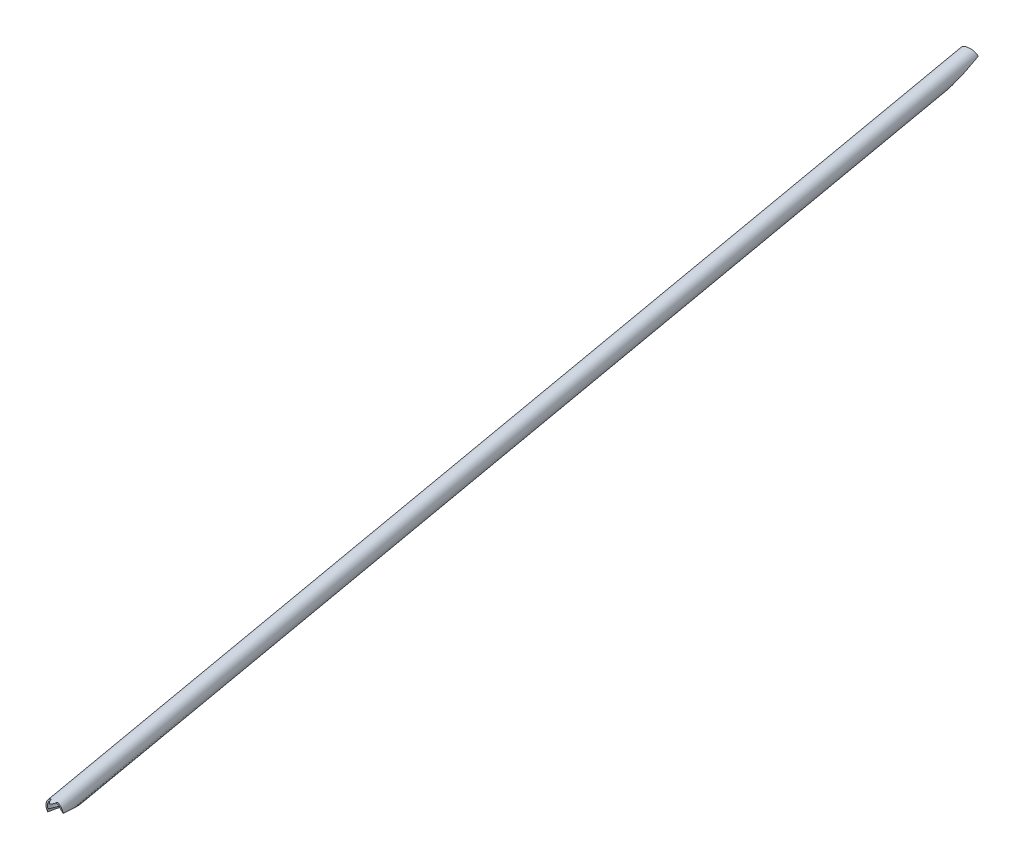
ISO-10303-21;
HEADER;
FILE_DESCRIPTION(('STEP AP214'),'2;1');
FILE_NAME('part.step','',(''),(''),'','','');
FILE_SCHEMA(('AUTOMOTIVE_DESIGN { 1 0 10303 214 1 1 1 1 }'));
ENDSEC;
DATA;
#1=APPLICATION_CONTEXT('core data for automotive mechanical design processes');
#2=APPLICATION_PROTOCOL_DEFINITION('international standard','automotive_design',2000,#1);
#3=PRODUCT_CONTEXT('',#1,'mechanical');
#4=PRODUCT('Part','Part','',(#3));
#5=PRODUCT_RELATED_PRODUCT_CATEGORY('part','',(#4));
#6=PRODUCT_DEFINITION_FORMATION('','',#4);
#7=PRODUCT_DEFINITION_CONTEXT('part definition',#1,'design');
#8=PRODUCT_DEFINITION('design','',#6,#7);
#9=PRODUCT_DEFINITION_SHAPE('','',#8);
#10=(LENGTH_UNIT() NAMED_UNIT(*) SI_UNIT(.MILLI.,.METRE.));
#11=(NAMED_UNIT(*) PLANE_ANGLE_UNIT() SI_UNIT($,.RADIAN.));
#12=(NAMED_UNIT(*) SI_UNIT($,.STERADIAN.) SOLID_ANGLE_UNIT());
#13=UNCERTAINTY_MEASURE_WITH_UNIT(LENGTH_MEASURE(1.E-05),#10,'distance_accuracy_value','');
#14=(GEOMETRIC_REPRESENTATION_CONTEXT(3) GLOBAL_UNCERTAINTY_ASSIGNED_CONTEXT((#13)) GLOBAL_UNIT_ASSIGNED_CONTEXT((#10,
#11,#12)) REPRESENTATION_CONTEXT('',''));
#15=CARTESIAN_POINT('',(0.,0.,0.));
#16=DIRECTION('',(0.,0.,1.));
#17=DIRECTION('',(1.,0.,0.));
#18=AXIS2_PLACEMENT_3D('',#15,#16,#17);
#19=CARTESIAN_POINT('',(-225.,200.,-450.));
#20=DIRECTION('',(-0.0876619818920292,0.105194378270435,-0.99058039537993));
#21=DIRECTION('',(0.,0.994408591727349,0.105600912395825));
#22=AXIS2_PLACEMENT_3D('',#19,#20,#21);
#23=CYLINDRICAL_SURFACE('',#22,7.90000000000002);
#24=CARTESIAN_POINT('',(-324.494857679556,327.249657090113,-1573.45764457105));
#25=CARTESIAN_POINT('',(-324.296689879201,327.249538639366,-1573.45650378848));
#26=CARTESIAN_POINT('',(-324.098568587815,327.241799828148,-1573.45368803407));
#27=CARTESIAN_POINT('',(-323.703552705225,327.211164300513,-1573.44371775323));
#28=CARTESIAN_POINT('',(-323.506658323396,327.188265064786,-1573.4365625057));
#29=CARTESIAN_POINT('',(-323.115284979527,327.127502560573,-1573.41673382982));
#30=CARTESIAN_POINT('',(-322.920808373339,327.089625721913,-1573.40405539623));
#31=CARTESIAN_POINT('',(-322.535834925719,326.999337341449,-1573.37181583881));
#32=CARTESIAN_POINT('',(-322.345337913884,326.946926423361,-1573.35225501033));
#33=CARTESIAN_POINT('',(-321.968884951476,326.827974486444,-1573.30462379601));
#34=CARTESIAN_POINT('',(-321.78295448848,326.76136835069,-1573.27651393087));
#35=CARTESIAN_POINT('',(-321.418095876194,326.615202277705,-1573.210206048));
#36=CARTESIAN_POINT('',(-321.239167718372,326.535642356255,-1573.17200804257));
#37=CARTESIAN_POINT('',(-320.890098910487,326.36511854164,-1573.08404347995));
#38=CARTESIAN_POINT('',(-320.71994624847,326.274170854375,-1573.03429327836));
#39=CARTESIAN_POINT('',(-320.389611823924,326.082634658492,-1572.92192667784));
#40=CARTESIAN_POINT('',(-320.229429006663,325.982047172559,-1572.85931164294));
#41=CARTESIAN_POINT('',(-319.932123979686,325.781469743354,-1572.72578816087));
#42=CARTESIAN_POINT('',(-319.794175769135,325.682029633556,-1572.65588890184));
#43=CARTESIAN_POINT('',(-319.52839231927,325.47868486577,-1572.50434293717));
#44=CARTESIAN_POINT('',(-319.400557458651,325.374780040825,-1572.42269579195));
#45=CARTESIAN_POINT('',(-319.155265512826,325.164367808314,-1572.24803421173));
#46=CARTESIAN_POINT('',(-319.037807542894,325.057860623614,-1572.15502074744));
#47=CARTESIAN_POINT('',(-318.813091607563,324.843872647055,-1571.95841469823));
#48=CARTESIAN_POINT('',(-318.705835157597,324.736391713135,-1571.85482054629));
#49=CARTESIAN_POINT('',(-318.459675903139,324.478464565054,-1571.59434431257));
#50=CARTESIAN_POINT('',(-318.325479765852,324.328191682368,-1571.43283429691));
#51=CARTESIAN_POINT('',(-318.074111079321,324.030884082435,-1571.09434898846));
#52=CARTESIAN_POINT('',(-317.95694736986,323.883851080024,-1570.91736574087));
#53=CARTESIAN_POINT('',(-317.736819343712,323.593793305635,-1570.55046108381));
#54=CARTESIAN_POINT('',(-317.633909897027,323.450785623584,-1570.36049366458));
#55=CARTESIAN_POINT('',(-317.440451749016,323.169805186999,-1569.97094503028));
#56=CARTESIAN_POINT('',(-317.349900434665,323.031831372629,-1569.77136585966));
#57=CARTESIAN_POINT('',(-317.199957829584,322.793940097284,-1569.41442038714));
#58=CARTESIAN_POINT('',(-317.13836178898,322.692967526511,-1569.25866686775));
#59=CARTESIAN_POINT('',(-317.020274836136,322.493666588615,-1568.94356475505));
#60=CARTESIAN_POINT('',(-316.963784348933,322.395338442117,-1568.78421586382));
#61=CARTESIAN_POINT('',(-316.800922063443,322.103954452083,-1568.30154073546));
#62=CARTESIAN_POINT('',(-316.70121771933,321.914593203998,-1567.97372895926));
#63=CARTESIAN_POINT('',(-316.515376743058,321.543720986637,-1567.30900993216));
#64=CARTESIAN_POINT('',(-316.429271478182,321.362228847307,-1566.97208369397));
#65=CARTESIAN_POINT('',(-316.268117257677,321.006019309157,-1566.29220230802));
#66=CARTESIAN_POINT('',(-316.19306568849,320.831300316102,-1565.94924860693));
#67=CARTESIAN_POINT('',(-316.051643042864,320.486328315659,-1565.2569273148));
#68=CARTESIAN_POINT('',(-315.98532187534,320.316105086501,-1564.90753485068));
#69=CARTESIAN_POINT('',(-315.860440569791,319.980007757438,-1564.20528290703));
#70=CARTESIAN_POINT('',(-315.801880792083,319.814133859735,-1563.85242326736));
#71=CARTESIAN_POINT('',(-315.691609507874,319.486055138055,-1563.14453305405));
#72=CARTESIAN_POINT('',(-315.639888949028,319.323845704612,-1562.78950601412));
#73=CARTESIAN_POINT('',(-315.542511869236,319.002125561371,-1562.07740066217));
#74=CARTESIAN_POINT('',(-315.496855483472,318.842614911804,-1561.7203223046));
#75=CARTESIAN_POINT('',(-315.396879955877,318.47303460663,-1560.88568248539));
#76=CARTESIAN_POINT('',(-315.344721855638,318.263773145231,-1560.40750427127));
#77=CARTESIAN_POINT('',(-315.249596336802,317.847777368105,-1559.44913529436));
#78=CARTESIAN_POINT('',(-315.206629117999,317.641043107407,-1558.96894448805));
#79=CARTESIAN_POINT('',(-315.129541178523,317.229060849197,-1558.00693466545));
#80=CARTESIAN_POINT('',(-315.095424867012,317.023813641774,-1557.52511495832));
#81=CARTESIAN_POINT('',(-315.036031448654,316.614121246245,-1556.56059733395));
#82=CARTESIAN_POINT('',(-315.01075424154,316.409676049067,-1556.07789942674));
#83=CARTESIAN_POINT('',(-314.969344831441,316.001678455156,-1555.11391145681));
#84=CARTESIAN_POINT('',(-314.953178033362,315.798125633518,-1554.6326230675));
#85=CARTESIAN_POINT('',(-314.930322094859,315.390504567365,-1553.67002523162));
#86=CARTESIAN_POINT('',(-314.923633119733,315.186436313923,-1553.18871578483));
#87=CARTESIAN_POINT('',(-314.920502797645,314.777260747945,-1552.22670390903));
#88=CARTESIAN_POINT('',(-314.924057750783,314.572153837263,-1551.74600132357));
#89=CARTESIAN_POINT('',(-314.942528637667,314.160221340324,-1550.7855659987));
#90=CARTESIAN_POINT('',(-314.957444024236,313.953395837317,-1550.30583321368));
#91=CARTESIAN_POINT('',(-315.000276313997,313.536997695759,-1549.34717804512));
#92=CARTESIAN_POINT('',(-315.028214843862,313.327421053337,-1548.86825834464));
#93=CARTESIAN_POINT('',(-315.099405333054,312.905018527821,-1547.91281552302));
#94=CARTESIAN_POINT('',(-315.142660657017,312.69219194065,-1547.4362929518));
#95=CARTESIAN_POINT('',(-315.221645137719,312.369774538986,-1546.72438601082));
#96=CARTESIAN_POINT('',(-315.250332139892,312.261746133146,-1546.48750658461));
#97=CARTESIAN_POINT('',(-315.313022687496,312.044490352863,-1546.01500888857));
#98=CARTESIAN_POINT('',(-315.347026002803,311.935263030506,-1545.7793905646));
#99=CARTESIAN_POINT('',(-315.421083506967,311.715474810918,-1545.30984127215));
#100=CARTESIAN_POINT('',(-315.461135275332,311.604914463354,-1545.07590966773));
#101=CARTESIAN_POINT('',(-315.548270316078,311.382217832965,-1544.61012717344));
#102=CARTESIAN_POINT('',(-315.595352974154,311.270081688596,-1544.37827610367));
#103=CARTESIAN_POINT('',(-315.697996902301,311.043626799201,-1543.91659059503));
#104=CARTESIAN_POINT('',(-315.753583924849,310.929302380059,-1543.68676460259));
#105=CARTESIAN_POINT('',(-315.874921606526,310.69846183182,-1543.23076529918));
#106=CARTESIAN_POINT('',(-315.940676166764,310.581944876619,-1543.00459342718));
#107=CARTESIAN_POINT('',(-316.084851112295,310.346386101057,-1542.55752599592));
#108=CARTESIAN_POINT('',(-316.163275219398,310.227343547729,-1542.33663200907));
#109=CARTESIAN_POINT('',(-316.336359605011,309.986461535556,-1541.90292636534));
#110=CARTESIAN_POINT('',(-316.43100470029,309.864624783698,-1541.69010737557));
#111=CARTESIAN_POINT('',(-316.589865836077,309.679028343337,-1541.3796691742));
#112=CARTESIAN_POINT('',(-316.645929308063,309.616397816582,-1541.27720908763));
#113=CARTESIAN_POINT('',(-316.764659640415,309.490400689369,-1541.07668911655));
#114=CARTESIAN_POINT('',(-316.827323560864,309.427034427712,-1540.97862730053));
#115=CARTESIAN_POINT('',(-316.960230477743,309.299929267425,-1540.78876318804));
#116=CARTESIAN_POINT('',(-317.030440625479,309.236193041742,-1540.69693639098));
#117=CARTESIAN_POINT('',(-317.180056156801,309.108462917701,-1540.52140088796));
#118=CARTESIAN_POINT('',(-317.259450092758,309.04446943409,-1540.43768230933));
#119=CARTESIAN_POINT('',(-317.421730201267,308.922379814471,-1540.28829766725));
#120=CARTESIAN_POINT('',(-317.503717018741,308.864253344943,-1540.22169579862));
#121=CARTESIAN_POINT('',(-317.67771096299,308.749330958372,-1540.10142642838));
#122=CARTESIAN_POINT('',(-317.769716198409,308.692534792635,-1540.0477564915));
#123=CARTESIAN_POINT('',(-317.965045413378,308.581279953833,-1539.95714042787));
#124=CARTESIAN_POINT('',(-318.068501737599,308.526861587815,-1539.9204223047));
#125=CARTESIAN_POINT('',(-318.283433154133,308.423812299123,-1539.86918960217));
#126=CARTESIAN_POINT('',(-318.3948925868,308.375170543253,-1539.85463283617));
#127=CARTESIAN_POINT('',(-318.60711923908,308.291626843632,-1539.84963816308));
#128=CARTESIAN_POINT('',(-318.707454957303,308.255765153183,-1539.85638161908));
#129=CARTESIAN_POINT('',(-318.907808007856,308.190896460869,-1539.88672246772));
#130=CARTESIAN_POINT('',(-319.007824860652,308.161897143933,-1539.91033863773));
#131=CARTESIAN_POINT('',(-319.238862427166,308.101860007865,-1539.98227890872));
#132=CARTESIAN_POINT('',(-319.368779585226,308.07352094242,-1540.03629282289));
#133=CARTESIAN_POINT('',(-319.62119529399,308.027094458755,-1540.16279453474));
#134=CARTESIAN_POINT('',(-319.743675158505,308.009031979741,-1540.23532666022));
#135=CARTESIAN_POINT('',(-319.969599191799,307.982387938161,-1540.3857427258));
#136=CARTESIAN_POINT('',(-320.073747362824,307.973070129794,-1540.46246814865));
#137=CARTESIAN_POINT('',(-320.276276584897,307.959786625695,-1540.62368643787));
#138=CARTESIAN_POINT('',(-320.374652392829,307.955825725869,-1540.70818619223));
#139=CARTESIAN_POINT('',(-320.566422713659,307.952229306429,-1540.88312518192));
#140=CARTESIAN_POINT('',(-320.659804908962,307.9526040278,-1540.97357797787));
#141=CARTESIAN_POINT('',(-320.84194049228,307.956915024125,-1541.15883970481));
#142=CARTESIAN_POINT('',(-320.930695666293,307.960849913952,-1541.25364692806));
#143=CARTESIAN_POINT('',(-321.156812341659,307.974948815367,-1541.50520492789));
#144=CARTESIAN_POINT('',(-321.291015359324,307.987443131687,-1541.66465906551));
#145=CARTESIAN_POINT('',(-321.551043556912,308.018259474915,-1541.98976454144));
#146=CARTESIAN_POINT('',(-321.676863915537,308.036584821145,-1542.15541936198));
#147=CARTESIAN_POINT('',(-321.921727301815,308.077912040002,-1542.49155331777));
#148=CARTESIAN_POINT('',(-322.040757052046,308.100922697763,-1542.66204099014));
#149=CARTESIAN_POINT('',(-322.272892655858,308.150752664434,-1543.00646359163));
#150=CARTESIAN_POINT('',(-322.385997802243,308.177572426611,-1543.18039892889));
#151=CARTESIAN_POINT('',(-322.607773821035,308.234570916902,-1543.53198519189));
#152=CARTESIAN_POINT('',(-322.716414523275,308.264768566624,-1543.70965200527));
#153=CARTESIAN_POINT('',(-322.929230721901,308.327925203974,-1544.06715695747));
#154=CARTESIAN_POINT('',(-323.033406029452,308.360884308205,-1544.2469951877));
#155=CARTESIAN_POINT('',(-323.237691766775,308.429157858901,-1544.608188908));
#156=CARTESIAN_POINT('',(-323.33780750058,308.464469061509,-1544.78954201867));
#157=CARTESIAN_POINT('',(-323.534553941249,308.537209015438,-1545.15369710217));
#158=CARTESIAN_POINT('',(-323.631184718614,308.574637723882,-1545.33649904559));
#159=CARTESIAN_POINT('',(-323.925182575597,308.693297336177,-1545.90363673839));
#160=CARTESIAN_POINT('',(-324.117306320486,308.777721433603,-1546.29002923335));
#161=CARTESIAN_POINT('',(-324.490488392503,308.953381461244,-1547.06661552691));
#162=CARTESIAN_POINT('',(-324.671545051867,309.044618413551,-1547.45680988822));
#163=CARTESIAN_POINT('',(-325.024433369406,309.233001075117,-1548.24017013204));
#164=CARTESIAN_POINT('',(-325.196260325262,309.330149743498,-1548.63333741498));
#165=CARTESIAN_POINT('',(-325.531927538286,309.529676363253,-1549.42175193099));
#166=CARTESIAN_POINT('',(-325.695767541467,309.632054480713,-1549.81699922976));
#167=CARTESIAN_POINT('',(-326.016936547975,309.841916173979,-1550.61017442227));
#168=CARTESIAN_POINT('',(-326.174245526068,309.949413552583,-1551.0081067531));
#169=CARTESIAN_POINT('',(-326.482665345276,310.168977603534,-1551.80511199595));
#170=CARTESIAN_POINT('',(-326.63377611252,310.281044330308,-1552.2041849215));
#171=CARTESIAN_POINT('',(-326.930399703143,310.509573665269,-1553.00298692872));
#172=CARTESIAN_POINT('',(-327.075914368412,310.626034801647,-1553.40271574854));
#173=CARTESIAN_POINT('',(-327.361932648536,310.863368882901,-1554.20266225174));
#174=CARTESIAN_POINT('',(-327.502436179777,310.984241901325,-1554.60287994316));
#175=CARTESIAN_POINT('',(-327.77850371143,311.230159114626,-1555.40245228373));
#176=CARTESIAN_POINT('',(-327.914079788087,311.355191437815,-1555.80180641745));
#177=CARTESIAN_POINT('',(-328.181044800087,311.609925425136,-1556.60042503442));
#178=CARTESIAN_POINT('',(-328.312433734094,311.739627090759,-1556.99968951766));
#179=CARTESIAN_POINT('',(-328.571356402029,312.004050472082,-1557.79792300007));
#180=CARTESIAN_POINT('',(-328.698889204922,312.138773382871,-1558.19689190555));
#181=CARTESIAN_POINT('',(-328.950310562262,312.413673716783,-1558.99409674171));
#182=CARTESIAN_POINT('',(-329.074199143293,312.5538511001,-1559.39233267771));
#183=CARTESIAN_POINT('',(-329.318245389817,312.839984949712,-1560.18677817144));
#184=CARTESIAN_POINT('',(-329.438410818075,312.985927712733,-1560.58299027211));
#185=CARTESIAN_POINT('',(-329.675418687416,313.284757197686,-1561.37378455245));
#186=CARTESIAN_POINT('',(-329.792261190781,313.437643789329,-1561.76836676255));
#187=CARTESIAN_POINT('',(-330.022616868952,313.751493203861,-1562.55512964749));
#188=CARTESIAN_POINT('',(-330.136131134015,313.912453334125,-1562.9473110747));
#189=CARTESIAN_POINT('',(-330.359764709317,314.244078548903,-1563.72851006297));
#190=CARTESIAN_POINT('',(-330.469884337589,314.414742719989,-1564.11752791789));
#191=CARTESIAN_POINT('',(-330.626810690119,314.670757922289,-1564.6782364532));
#192=CARTESIAN_POINT('',(-330.675102357827,314.751359278212,-1564.85168460444));
#193=CARTESIAN_POINT('',(-330.770877982967,314.915230624765,-1565.19754116823));
#194=CARTESIAN_POINT('',(-330.818361936591,314.998500627972,-1565.36994957589));
#195=CARTESIAN_POINT('',(-330.959529250973,315.252774606978,-1565.88545822749));
#196=CARTESIAN_POINT('',(-331.051903602585,315.428203020807,-1566.22675455689));
#197=CARTESIAN_POINT('',(-331.232224595111,315.793571519908,-1566.90249218801));
#198=CARTESIAN_POINT('',(-331.320173945472,315.983502541281,-1567.23693760831));
#199=CARTESIAN_POINT('',(-331.447556003406,316.282132305849,-1567.73142737195));
#200=CARTESIAN_POINT('',(-331.489255802438,316.383953703808,-1567.89504510117));
#201=CARTESIAN_POINT('',(-331.570817842546,316.592758002812,-1568.21941280823));
#202=CARTESIAN_POINT('',(-331.610680204349,316.699740563801,-1568.38016297404));
#203=CARTESIAN_POINT('',(-331.700514982912,316.954521297886,-1568.74893072304));
#204=CARTESIAN_POINT('',(-331.749660230695,317.104460441211,-1568.95568351541));
#205=CARTESIAN_POINT('',(-331.842752974708,317.415979864877,-1569.36154546151));
#206=CARTESIAN_POINT('',(-331.886699954335,317.577561299666,-1569.5606538542));
#207=CARTESIAN_POINT('',(-331.967457705793,317.913603026559,-1569.94864245543));
#208=CARTESIAN_POINT('',(-332.004281650638,318.088038705009,-1570.1375410699));
#209=CARTESIAN_POINT('',(-332.068362414171,318.451292151817,-1570.50273832443));
#210=CARTESIAN_POINT('',(-332.095623412898,318.640103592384,-1570.67904244275));
#211=CARTESIAN_POINT('',(-332.131648052612,318.978970284389,-1570.96997286986));
#212=CARTESIAN_POINT('',(-332.143429910684,319.125530958342,-1571.08829579016));
#213=CARTESIAN_POINT('',(-332.158796854571,319.42620219848,-1571.31547449399));
#214=CARTESIAN_POINT('',(-332.16238454403,319.580310350601,-1571.42433327412));
#215=CARTESIAN_POINT('',(-332.159898445025,319.895201727712,-1571.63149124995));
#216=CARTESIAN_POINT('',(-332.153834372031,320.055978081868,-1571.72980095806));
#217=CARTESIAN_POINT('',(-332.130683173236,320.383077581024,-1571.91530183692));
#218=CARTESIAN_POINT('',(-332.11359610493,320.54940069709,-1572.00249306566));
#219=CARTESIAN_POINT('',(-332.067156036403,320.886621952854,-1572.16590213151));
#220=CARTESIAN_POINT('',(-332.037748846353,321.057537143688,-1572.24206946396));
#221=CARTESIAN_POINT('',(-331.965862577949,321.401208508474,-1572.38327650069));
#222=CARTESIAN_POINT('',(-331.923383024825,321.573964749069,-1572.44831580067));
#223=CARTESIAN_POINT('',(-331.824896474343,321.919399004234,-1572.56810412532));
#224=CARTESIAN_POINT('',(-331.768874958554,322.092076734215,-1572.62284199297));
#225=CARTESIAN_POINT('',(-331.643287740431,322.435167729305,-1572.7230501086));
#226=CARTESIAN_POINT('',(-331.573722002928,322.605580988532,-1572.76852033252));
#227=CARTESIAN_POINT('',(-331.425274074072,322.93357187111,-1572.84930592702));
#228=CARTESIAN_POINT('',(-331.347065405042,323.091355865809,-1572.8850267133));
#229=CARTESIAN_POINT('',(-331.179105450735,323.401940307298,-1572.95039109218));
#230=CARTESIAN_POINT('',(-331.089354764694,323.554741012293,-1572.98003500008));
#231=CARTESIAN_POINT('',(-330.898824835171,323.854211063643,-1573.03429487374));
#232=CARTESIAN_POINT('',(-330.798046397379,324.000880856842,-1573.05891120645));
#233=CARTESIAN_POINT('',(-330.586038204394,324.28713134378,-1573.10406714212));
#234=CARTESIAN_POINT('',(-330.47480744995,324.42671135776,-1573.12460635471));
#235=CARTESIAN_POINT('',(-330.229551528459,324.713090095238,-1573.16454534272));
#236=CARTESIAN_POINT('',(-330.094368178533,324.858952006712,-1573.18356119095));
#237=CARTESIAN_POINT('',(-329.812813595828,325.139847426065,-1573.21851254968));
#238=CARTESIAN_POINT('',(-329.666441663054,325.274880255354,-1573.23444786722));
#239=CARTESIAN_POINT('',(-329.363403366602,325.533317066432,-1573.26398907565));
#240=CARTESIAN_POINT('',(-329.206731115373,325.656714297613,-1573.27759361798));
#241=CARTESIAN_POINT('',(-328.884182652681,325.891029252086,-1573.30301894572));
#242=CARTESIAN_POINT('',(-328.718306252172,326.001946718911,-1573.31483969447));
#243=CARTESIAN_POINT('',(-328.366470506762,326.217951899472,-1573.33785958939));
#244=CARTESIAN_POINT('',(-328.179918384351,326.322086447139,-1573.34895713247));
#245=CARTESIAN_POINT('',(-327.798762187514,326.514598831119,-1573.3698053628));
#246=CARTESIAN_POINT('',(-327.604157228173,326.602974930059,-1573.37955590151));
#247=CARTESIAN_POINT('',(-327.20842910326,326.763284531852,-1573.39774757242));
#248=CARTESIAN_POINT('',(-327.007311986482,326.835232820192,-1573.40618987983));
#249=CARTESIAN_POINT('',(-326.599838908853,326.962272014649,-1573.42161124748));
#250=CARTESIAN_POINT('',(-326.393484245599,327.017367052829,-1573.42859066627));
#251=CARTESIAN_POINT('',(-325.908088948126,327.125675654786,-1573.44273545499));
#252=CARTESIAN_POINT('',(-325.627525772152,327.172273417983,-1573.44920270059));
#253=CARTESIAN_POINT('',(-325.062895727213,327.234348590847,-1573.45747455816));
#254=CARTESIAN_POINT('',(-324.778828951628,327.249826828129,-1573.45927929414));
#255=CARTESIAN_POINT('',(-324.494857679556,327.249657090113,-1573.45764457105));
#256=B_SPLINE_CURVE_WITH_KNOTS('',3,(#24,#25,#26,#27,#28,#29,#30,#31,#32,#33,#34,#35,#36,#37,
#38,#39,#40,#41,#42,#43,#44,#45,#46,#47,#48,#49,#50,#51,#52,#53,#54,#55,#56,#57,#58,#59,#60,#61,
#62,#63,#64,#65,#66,#67,#68,#69,#70,#71,#72,#73,#74,#75,#76,#77,#78,#79,#80,#81,#82,#83,#84,#85,
#86,#87,#88,#89,#90,#91,#92,#93,#94,#95,#96,#97,#98,#99,#100,#101,#102,#103,#104,#105,#106,#107,
#108,#109,#110,#111,#112,#113,#114,#115,#116,#117,#118,#119,#120,#121,#122,#123,#124,#125,#126,
#127,#128,#129,#130,#131,#132,#133,#134,#135,#136,#137,#138,#139,#140,#141,#142,#143,#144,#145,
#146,#147,#148,#149,#150,#151,#152,#153,#154,#155,#156,#157,#158,#159,#160,#161,#162,#163,#164,
#165,#166,#167,#168,#169,#170,#171,#172,#173,#174,#175,#176,#177,#178,#179,#180,#181,#182,#183,
#184,#185,#186,#187,#188,#189,#190,#191,#192,#193,#194,#195,#196,#197,#198,#199,#200,#201,#202,
#203,#204,#205,#206,#207,#208,#209,#210,#211,#212,#213,#214,#215,#216,#217,#218,#219,#220,#221,
#222,#223,#224,#225,#226,#227,#228,#229,#230,#231,#232,#233,#234,#235,#236,#237,#238,#239,#240,
#241,#242,#243,#244,#245,#246,#247,#248,#249,#250,#251,#252,#253,#254,#255),.UNSPECIFIED.,.T.,
.F.,(4,2,2,2,2,2,2,2,2,2,2,2,2,2,2,2,2,2,2,2,2,2,2,2,2,2,2,2,2,2,2,2,2,2,2,2,2,2,2,2,2,2,2,2,2,
2,2,2,2,2,2,2,2,2,2,2,2,2,2,2,2,2,2,2,2,2,2,2,2,2,2,2,2,2,2,2,2,2,2,2,2,2,2,2,2,2,2,2,2,2,2,2,2,
2,2,2,2,2,2,2,2,2,2,2,2,2,2,2,2,2,2,2,2,2,2,4),(0.,0.594299918647612,1.18869862088451,
1.78363710534704,2.37855006259368,2.97625314360259,3.57395549638204,4.17081672713072,
4.76761470678919,5.31848084416798,5.86936759892455,6.42020734007407,6.97112878093292,
7.74448047551489,8.51823211540585,9.29488402381256,10.071371460407,10.6579665590397,
11.2446104467617,12.4184395918511,13.5949379179119,14.771157622103,15.9538336521343,
17.1365645677614,18.3177140155762,19.4988897891218,21.0724693064251,22.646083027051,
24.2204791594105,25.7948574321299,27.3632162980127,28.9316025164464,30.4994223363167,
32.0671666467514,33.6375237324701,35.2082259922182,35.9939549838612,36.7796499734969,
37.5650313698596,38.3503441856119,39.1380839169475,39.9261266439248,40.7144012889085,
41.5019420799552,41.8993449453983,42.2965715454989,42.6921341468796,43.0872088860432,
43.4480356202204,43.8087943524417,44.1742732801088,44.5390556034765,44.8576832832855,
45.1766661120647,45.6048135474786,46.0339956265389,46.4225066105532,46.8113651890135,
47.201142460889,47.5907681502793,48.216637926482,48.8428646192126,49.4702765057071,
50.097763114086,50.728959588293,51.3601827286657,51.9905526655166,52.6209098428123,
53.9397236402682,55.2587356901759,56.5784134934929,57.8981332356131,59.2216386484644,
60.5451598302414,61.8682415957698,63.1913454273223,64.5109514926868,65.8305579793834,
67.1504805724344,68.4703935344533,69.7873386094979,71.1042589845717,72.4207430332999,
73.7371033675801,74.3288748491768,74.9206491199516,76.1044943552094,77.2876056683769,
77.8790445674775,78.4704445512087,79.2503405542682,80.0303139984253,80.8088309079863,
81.5870070965185,82.1527038239913,82.7182207799089,83.283168846143,83.8481139657403,
84.4155705167669,84.983047679476,85.5511359579625,86.119225711605,86.6577418227755,
87.196229986671,87.7346788347444,88.2731792114946,88.8718664117239,89.4705910985419,
90.0696610364678,90.6687432834096,91.3098058061071,91.9509389624003,92.591492786174,
93.2318894335101,94.0835343122854,94.9351565414728),.UNSPECIFIED.);
#257=CARTESIAN_POINT('',(-324.494857679556,327.249657090113,-1573.45764457105));
#258=VERTEX_POINT('',#257);
#259=EDGE_CURVE('E114',#258,#258,#256,.T.);
#260=ORIENTED_EDGE('',*,*,#259,.T.);
#261=EDGE_LOOP('',(#260));
#262=FACE_BOUND('',#261,.T.);
#263=CARTESIAN_POINT('',(-225.476779200972,208.427962915812,-454.553357763052));
#264=CARTESIAN_POINT('',(-225.694650365765,208.424693319738,-454.52256823201));
#265=CARTESIAN_POINT('',(-225.912798380038,208.41250901632,-454.49472068672));
#266=CARTESIAN_POINT('',(-226.348037133721,208.370257268957,-454.444193607684));
#267=CARTESIAN_POINT('',(-226.565127462757,208.340183366843,-454.421515944363));
#268=CARTESIAN_POINT('',(-226.996838214913,208.262220305608,-454.380822511247));
#269=CARTESIAN_POINT('',(-227.211454820398,208.214306643337,-454.362813211489));
#270=CARTESIAN_POINT('',(-227.636341235557,208.100955457807,-454.331203024856));
#271=CARTESIAN_POINT('',(-227.84661102577,208.035517856117,-454.317602157712));
#272=CARTESIAN_POINT('',(-228.261120431547,207.887618131689,-454.29470895204));
#273=CARTESIAN_POINT('',(-228.465364875238,207.805170087714,-454.285413070987));
#274=CARTESIAN_POINT('',(-228.866565573271,207.62379760244,-454.271181346598));
#275=CARTESIAN_POINT('',(-229.063521666356,207.524872796856,-454.266245599676));
#276=CARTESIAN_POINT('',(-229.448700467196,207.311311719644,-454.260980777894));
#277=CARTESIAN_POINT('',(-229.636926136061,207.196680828005,-454.260650129561));
#278=CARTESIAN_POINT('',(-230.003416484199,206.952554214424,-454.26502036582));
#279=CARTESIAN_POINT('',(-230.181681206492,206.823058556687,-454.26972122868));
#280=CARTESIAN_POINT('',(-230.527340927229,206.549982086696,-454.284794048063));
#281=CARTESIAN_POINT('',(-230.694715973186,206.406376566309,-454.295176103682));
#282=CARTESIAN_POINT('',(-231.017113648532,206.106468804366,-454.322465910634));
#283=CARTESIAN_POINT('',(-231.172136114045,205.95016639442,-454.339373748525));
#284=CARTESIAN_POINT('',(-231.46886730069,205.626167870843,-454.3808156295));
#285=CARTESIAN_POINT('',(-231.610568665806,205.458465549141,-454.405353854301));
#286=CARTESIAN_POINT('',(-231.879626690067,205.113374696665,-454.463406855611));
#287=CARTESIAN_POINT('',(-232.006983699853,204.93598640282,-454.496921412629));
#288=CARTESIAN_POINT('',(-232.243779397947,204.577654865723,-454.573648869282));
#289=CARTESIAN_POINT('',(-232.353564814702,204.396889155136,-454.616619129347));
#290=CARTESIAN_POINT('',(-232.558106855292,204.030100108107,-454.714401980395));
#291=CARTESIAN_POINT('',(-232.652863391063,203.844076740863,-454.769214640767));
#292=CARTESIAN_POINT('',(-232.826830558562,203.469679186922,-454.892411730545));
#293=CARTESIAN_POINT('',(-232.906068455882,203.281309753111,-454.96077192438));
#294=CARTESIAN_POINT('',(-233.049156586391,202.904927024498,-455.112862122784));
#295=CARTESIAN_POINT('',(-233.11300986652,202.716913666506,-455.196589078153));
#296=CARTESIAN_POINT('',(-233.219357394723,202.365713384884,-455.370284078467));
#297=CARTESIAN_POINT('',(-233.26345224399,202.202127908787,-455.45846911435));
#298=CARTESIAN_POINT('',(-233.340521452766,201.8802847998,-455.648356934452));
#299=CARTESIAN_POINT('',(-233.373497460091,201.72202638057,-455.750057712516));
#300=CARTESIAN_POINT('',(-233.429294246328,201.413132392122,-455.966678849043));
#301=CARTESIAN_POINT('',(-233.45212265168,201.26249117391,-456.081589197814));
#302=CARTESIAN_POINT('',(-233.488918957816,200.97039242648,-456.323820711368));
#303=CARTESIAN_POINT('',(-233.502885765358,200.828936032311,-456.451143405211));
#304=CARTESIAN_POINT('',(-233.524809879873,200.536856459833,-456.735723788796));
#305=CARTESIAN_POINT('',(-233.531630330712,200.387789772735,-456.894663735688));
#306=CARTESIAN_POINT('',(-233.537584479536,200.103420924045,-457.224508368819));
#307=CARTESIAN_POINT('',(-233.536716321084,199.968122094722,-457.395415934791));
#308=CARTESIAN_POINT('',(-233.52908076127,199.710417753759,-457.747231236255));
#309=CARTESIAN_POINT('',(-233.52229676069,199.588049608317,-457.928165767497));
#310=CARTESIAN_POINT('',(-233.504257489357,199.355548660273,-458.297434374305));
#311=CARTESIAN_POINT('',(-233.49300248032,199.245415141985,-458.485768016173));
#312=CARTESIAN_POINT('',(-233.463740349792,199.008678502704,-458.918037969987));
#313=CARTESIAN_POINT('',(-233.444737577287,198.88528166161,-459.163654561335));
#314=CARTESIAN_POINT('',(-233.402878965376,198.653022977145,-459.66140250997));
#315=CARTESIAN_POINT('',(-233.380021224457,198.544168354638,-459.913537030089));
#316=CARTESIAN_POINT('',(-233.331363777635,198.338448367469,-460.422876949155));
#317=CARTESIAN_POINT('',(-233.305558709815,198.241605544709,-460.680090862696));
#318=CARTESIAN_POINT('',(-233.251636374343,198.058132214991,-461.197818401539));
#319=CARTESIAN_POINT('',(-233.223519478964,197.971500069257,-461.458331489882));
#320=CARTESIAN_POINT('',(-233.165110857369,197.806193021481,-461.983689997074));
#321=CARTESIAN_POINT('',(-233.134804964961,197.727579720623,-462.248553092115));
#322=CARTESIAN_POINT('',(-233.072398944155,197.577678539599,-462.780129384782));
#323=CARTESIAN_POINT('',(-233.040298767579,197.506390856281,-463.046842631918));
#324=CARTESIAN_POINT('',(-232.974441138958,197.370149528731,-463.581344419699));
#325=CARTESIAN_POINT('',(-232.940685603945,197.305188806206,-463.849131401472));
#326=CARTESIAN_POINT('',(-232.871514839979,197.180657748106,-464.385748913614));
#327=CARTESIAN_POINT('',(-232.836099539595,197.121087644848,-464.654579488438));
#328=CARTESIAN_POINT('',(-232.761016578336,197.002582843253,-465.212194213118));
#329=CARTESIAN_POINT('',(-232.72122571825,196.943995754037,-465.501035470509));
#330=CARTESIAN_POINT('',(-232.639672960128,196.831568009852,-466.079365545977));
#331=CARTESIAN_POINT('',(-232.597911007081,196.777727487479,-466.368854381914));
#332=CARTESIAN_POINT('',(-232.469541949329,196.622500211073,-467.238050159652));
#333=CARTESIAN_POINT('',(-232.379858239388,196.527417998308,-467.818437148648));
#334=CARTESIAN_POINT('',(-232.19126224978,196.350987259584,-468.980500228372));
#335=CARTESIAN_POINT('',(-232.09233905278,196.269655307898,-469.562177030578));
#336=CARTESIAN_POINT('',(-231.88411616385,196.119109523951,-470.725198885054));
#337=CARTESIAN_POINT('',(-231.774817249887,196.049894784252,-471.306543958912));
#338=CARTESIAN_POINT('',(-231.544899177923,195.922993188785,-472.46479233124));
#339=CARTESIAN_POINT('',(-231.424347823035,195.865243106584,-473.041702107212));
#340=CARTESIAN_POINT('',(-231.169345330825,195.760520873164,-474.193508974235));
#341=CARTESIAN_POINT('',(-231.034892567881,195.71354998453,-474.768405821749));
#342=CARTESIAN_POINT('',(-230.749542660644,195.630821328847,-475.914177991311));
#343=CARTESIAN_POINT('',(-230.598667277908,195.595048960688,-476.485057593281));
#344=CARTESIAN_POINT('',(-230.357000104868,195.550629865147,-477.337424077689));
#345=CARTESIAN_POINT('',(-230.273894471639,195.537364277012,-477.62085918154));
#346=CARTESIAN_POINT('',(-230.101886157003,195.514165703431,-478.186096711334));
#347=CARTESIAN_POINT('',(-230.012983750521,195.504232560074,-478.467899214019));
#348=CARTESIAN_POINT('',(-229.822398256976,195.48748371594,-479.048254712088));
#349=CARTESIAN_POINT('',(-229.72025797593,195.48092132701,-479.346665671627));
#350=CARTESIAN_POINT('',(-229.507174022893,195.472517518457,-479.940477243932));
#351=CARTESIAN_POINT('',(-229.396228804366,195.470676930092,-480.235877317525));
#352=CARTESIAN_POINT('',(-229.16389511631,195.472500832932,-480.822491603513));
#353=CARTESIAN_POINT('',(-229.042508438963,195.47616438117,-481.113706524276));
#354=CARTESIAN_POINT('',(-228.787031737852,195.490105236103,-481.690329205974));
#355=CARTESIAN_POINT('',(-228.652945987337,195.500380324704,-481.975738881383));
#356=CARTESIAN_POINT('',(-228.430405465297,195.522970451779,-482.416173201522));
#357=CARTESIAN_POINT('',(-228.347369726304,195.532469887425,-482.57408100663));
#358=CARTESIAN_POINT('',(-228.175374325417,195.554563390976,-482.886402596409));
#359=CARTESIAN_POINT('',(-228.086415733985,195.567156900778,-483.040817005732));
#360=CARTESIAN_POINT('',(-227.901622364042,195.595979596025,-483.345074718109));
#361=CARTESIAN_POINT('',(-227.805790409207,195.612207294244,-483.494919862634));
#362=CARTESIAN_POINT('',(-227.606024291049,195.64901884796,-483.788507286689));
#363=CARTESIAN_POINT('',(-227.50209360495,195.669600840363,-483.9322521449));
#364=CARTESIAN_POINT('',(-227.262647949612,195.720754113994,-484.239621816374));
#365=CARTESIAN_POINT('',(-227.124989535593,195.752502720757,-484.401412499954));
#366=CARTESIAN_POINT('',(-226.83265342234,195.825866855597,-484.706574753965));
#367=CARTESIAN_POINT('',(-226.678000196058,195.867468292618,-484.849972182176));
#368=CARTESIAN_POINT('',(-226.399224235657,195.948631347161,-485.068043497147));
#369=CARTESIAN_POINT('',(-226.280191994553,195.984939403256,-485.150333906038));
#370=CARTESIAN_POINT('',(-226.032696613676,196.06442408438,-485.29511597888));
#371=CARTESIAN_POINT('',(-225.904251322474,196.107587882533,-485.357643977065));
#372=CARTESIAN_POINT('',(-225.663485499013,196.192564147639,-485.447901288578));
#373=CARTESIAN_POINT('',(-225.552367468743,196.233248106649,-485.479844920749));
#374=CARTESIAN_POINT('',(-225.327729644421,196.318668419068,-485.523349652176));
#375=CARTESIAN_POINT('',(-225.21421187632,196.363401451196,-485.534927300297));
#376=CARTESIAN_POINT('',(-224.988129160682,196.455675737517,-485.536829860681));
#377=CARTESIAN_POINT('',(-224.875564493486,196.503217787234,-485.52714872403));
#378=CARTESIAN_POINT('',(-224.654500190639,196.599611778806,-485.488049166196));
#379=CARTESIAN_POINT('',(-224.546004835387,196.648465012076,-485.458610545219));
#380=CARTESIAN_POINT('',(-224.295042481924,196.764768897529,-485.368676478208));
#381=CARTESIAN_POINT('',(-224.155322658253,196.832236110002,-485.300632227888));
#382=CARTESIAN_POINT('',(-223.88881029546,196.965395105161,-485.141474556982));
#383=CARTESIAN_POINT('',(-223.762051339059,197.031081966899,-485.050303236343));
#384=CARTESIAN_POINT('',(-223.533415376713,197.1531715123,-484.86232822964));
#385=CARTESIAN_POINT('',(-223.430323766563,197.209823602545,-484.767127867871));
#386=CARTESIAN_POINT('',(-223.232618285177,197.321161299755,-484.567161197991));
#387=CARTESIAN_POINT('',(-223.138011901912,197.375845144815,-484.462386602315));
#388=CARTESIAN_POINT('',(-222.956006328073,197.483443411842,-484.245487656473));
#389=CARTESIAN_POINT('',(-222.868624538686,197.53635338908,-484.133346665151));
#390=CARTESIAN_POINT('',(-222.700331412794,197.640422648414,-483.903649289543));
#391=CARTESIAN_POINT('',(-222.619417700887,197.691582569232,-483.786094918551));
#392=CARTESIAN_POINT('',(-222.420151493071,197.820087938992,-483.480860989151));
#393=CARTESIAN_POINT('',(-222.305696517619,197.896352284978,-483.29018707004));
#394=CARTESIAN_POINT('',(-222.087619135007,198.045792112635,-482.901522177146));
#395=CARTESIAN_POINT('',(-221.984002619076,198.118965901686,-482.703527302389));
#396=CARTESIAN_POINT('',(-221.785647917801,198.262814672971,-482.301788883966));
#397=CARTESIAN_POINT('',(-221.690926224152,198.333484868008,-482.098035539042));
#398=CARTESIAN_POINT('',(-221.509178233392,198.472594549056,-481.686371610052));
#399=CARTESIAN_POINT('',(-221.422152837103,198.54103377335,-481.478460542825));
#400=CARTESIAN_POINT('',(-221.254292327432,198.676367815616,-481.058240257418));
#401=CARTESIAN_POINT('',(-221.173493511291,198.743252191672,-480.845913252165));
#402=CARTESIAN_POINT('',(-221.017772841366,198.875363120442,-480.418605438772));
#403=CARTESIAN_POINT('',(-220.942851202065,198.940589612594,-480.203624534112));
#404=CARTESIAN_POINT('',(-220.798310813309,199.069532862896,-479.771754179558));
#405=CARTESIAN_POINT('',(-220.728685821845,199.133251335215,-479.554867323068));
#406=CARTESIAN_POINT('',(-220.5941106898,199.259451075895,-479.119296568562));
#407=CARTESIAN_POINT('',(-220.529160546988,199.321932344845,-478.900612671405));
#408=CARTESIAN_POINT('',(-220.384405653709,199.46465123013,-478.395044199434));
#409=CARTESIAN_POINT('',(-220.306084700531,199.544514834814,-478.107629059446));
#410=CARTESIAN_POINT('',(-220.155890810337,199.702744513422,-477.530704167875));
#411=CARTESIAN_POINT('',(-220.084018215272,199.781110507755,-477.241194306091));
#412=CARTESIAN_POINT('',(-219.877127544599,200.014412617539,-476.369993212594));
#413=CARTESIAN_POINT('',(-219.750862820959,200.167526764129,-475.785723850172));
#414=CARTESIAN_POINT('',(-219.518160150395,200.471044079371,-474.611599205285));
#415=CARTESIAN_POINT('',(-219.411753653789,200.621442612633,-474.021736591044));
#416=CARTESIAN_POINT('',(-219.217065278507,200.9210383406,-472.838808112231));
#417=CARTESIAN_POINT('',(-219.128781353083,201.070235669137,-472.245742617164));
#418=CARTESIAN_POINT('',(-218.969624495116,201.36877689693,-471.059490105854));
#419=CARTESIAN_POINT('',(-218.898693717293,201.518118595962,-470.466310276929));
#420=CARTESIAN_POINT('',(-218.773819086774,201.819567201806,-469.278793692635));
#421=CARTESIAN_POINT('',(-218.719877129746,201.971674415202,-468.684456815599));
#422=CARTESIAN_POINT('',(-218.630030988338,202.281073106452,-467.49655030511));
#423=CARTESIAN_POINT('',(-218.594103448144,202.438357588364,-466.902980678578));
#424=CARTESIAN_POINT('',(-218.555552752846,202.680986215196,-466.013859111104));
#425=CARTESIAN_POINT('',(-218.545259503268,202.762972484135,-465.717714712546));
#426=CARTESIAN_POINT('',(-218.530318898495,202.929776993699,-465.126086607357));
#427=CARTESIAN_POINT('',(-218.525671253265,203.014595088614,-464.830602867564));
#428=CARTESIAN_POINT('',(-218.523319660789,203.152609238888,-464.360383273876));
#429=CARTESIAN_POINT('',(-218.523562883564,203.204665259337,-464.185322161133));
#430=CARTESIAN_POINT('',(-218.526484138589,203.31019354861,-463.835650254155));
#431=CARTESIAN_POINT('',(-218.529162154892,203.363665808155,-463.661039456978));
#432=CARTESIAN_POINT('',(-218.541173081665,203.526506149805,-463.137964738565));
#433=CARTESIAN_POINT('',(-218.554483310517,203.638280463033,-462.790318029943));
#434=CARTESIAN_POINT('',(-218.594084176351,203.86998847447,-462.098500290079));
#435=CARTESIAN_POINT('',(-218.620373558576,203.989921382985,-461.754328926142));
#436=CARTESIAN_POINT('',(-218.689381931008,204.240091702724,-461.071407923993));
#437=CARTESIAN_POINT('',(-218.732095392348,204.370325634591,-460.732656501185));
#438=CARTESIAN_POINT('',(-218.821118209185,204.59785191659,-460.17548324165));
#439=CARTESIAN_POINT('',(-218.861457462149,204.69161142735,-459.954674703743));
#440=CARTESIAN_POINT('',(-218.953640859234,204.885448335689,-459.518203764096));
#441=CARTESIAN_POINT('',(-219.005486056019,204.985526310734,-459.302541835213));
#442=CARTESIAN_POINT('',(-219.12290327911,205.192220561838,-458.878721210223));
#443=CARTESIAN_POINT('',(-219.188446393305,205.298822737407,-458.670547776016));
#444=CARTESIAN_POINT('',(-219.33597216495,205.518706285314,-458.263750219042));
#445=CARTESIAN_POINT('',(-219.417947764615,205.631984775466,-458.06512204182));
#446=CARTESIAN_POINT('',(-219.576814153717,205.833630005081,-457.731189406355));
#447=CARTESIAN_POINT('',(-219.649334694162,205.920679058301,-457.593010278969));
#448=CARTESIAN_POINT('',(-219.805596307931,206.097094834243,-457.324733243422));
#449=CARTESIAN_POINT('',(-219.889333878267,206.186460826405,-457.194632830833));
#450=CARTESIAN_POINT('',(-220.068556040706,206.366263145545,-456.943810919803));
#451=CARTESIAN_POINT('',(-220.164028962067,206.456698329583,-456.82308029505));
#452=CARTESIAN_POINT('',(-220.366967422175,206.637180533398,-456.591816678495));
#453=CARTESIAN_POINT('',(-220.474432939808,206.727227553858,-456.481283668738));
#454=CARTESIAN_POINT('',(-220.701407537631,206.905415743204,-456.270659956992));
#455=CARTESIAN_POINT('',(-220.820952194643,206.993550295266,-456.170601979695));
#456=CARTESIAN_POINT('',(-221.071084712918,207.165763608693,-455.981395156051));
#457=CARTESIAN_POINT('',(-221.201673030684,207.249842202174,-455.892246761038));
#458=CARTESIAN_POINT('',(-221.473032603953,207.412295783771,-455.724372935702));
#459=CARTESIAN_POINT('',(-221.613818244429,207.490662388999,-455.645662690954));
#460=CARTESIAN_POINT('',(-221.904174502068,207.640019116262,-455.498098753274));
#461=CARTESIAN_POINT('',(-222.053745162247,207.711009202174,-455.429245108611));
#462=CARTESIAN_POINT('',(-222.356073667461,207.842478168412,-455.302285084212));
#463=CARTESIAN_POINT('',(-222.508624364164,207.903196069654,-455.243931379135));
#464=CARTESIAN_POINT('',(-222.819639602311,208.015560102492,-455.13475950887));
#465=CARTESIAN_POINT('',(-222.978104268346,208.067206042837,-455.083941502548));
#466=CARTESIAN_POINT('',(-223.299674352789,208.160678514133,-454.988999392382));
#467=CARTESIAN_POINT('',(-223.462775147822,208.202514467773,-454.944868879602));
#468=CARTESIAN_POINT('',(-223.792675678148,208.275904454496,-454.862435138582));
#469=CARTESIAN_POINT('',(-223.959474867836,208.30745999356,-454.824131057266));
#470=CARTESIAN_POINT('',(-224.349143505981,208.368232698963,-454.741273530287));
#471=CARTESIAN_POINT('',(-224.573031305387,208.393540119041,-454.698586155259));
#472=CARTESIAN_POINT('',(-225.023438854982,208.425108615335,-454.62065481235));
#473=CARTESIAN_POINT('',(-225.249958998127,208.431366810245,-454.585411971248));
#474=CARTESIAN_POINT('',(-225.476779200972,208.427962915812,-454.553357763052));
#475=B_SPLINE_CURVE_WITH_KNOTS('',3,(#263,#264,#265,#266,#267,#268,#269,#270,#271,#272,#273,
#274,#275,#276,#277,#278,#279,#280,#281,#282,#283,#284,#285,#286,#287,#288,#289,#290,#291,#292,
#293,#294,#295,#296,#297,#298,#299,#300,#301,#302,#303,#304,#305,#306,#307,#308,#309,#310,#311,
#312,#313,#314,#315,#316,#317,#318,#319,#320,#321,#322,#323,#324,#325,#326,#327,#328,#329,#330,
#331,#332,#333,#334,#335,#336,#337,#338,#339,#340,#341,#342,#343,#344,#345,#346,#347,#348,#349,
#350,#351,#352,#353,#354,#355,#356,#357,#358,#359,#360,#361,#362,#363,#364,#365,#366,#367,#368,
#369,#370,#371,#372,#373,#374,#375,#376,#377,#378,#379,#380,#381,#382,#383,#384,#385,#386,#387,
#388,#389,#390,#391,#392,#393,#394,#395,#396,#397,#398,#399,#400,#401,#402,#403,#404,#405,#406,
#407,#408,#409,#410,#411,#412,#413,#414,#415,#416,#417,#418,#419,#420,#421,#422,#423,#424,#425,
#426,#427,#428,#429,#430,#431,#432,#433,#434,#435,#436,#437,#438,#439,#440,#441,#442,#443,#444,
#445,#446,#447,#448,#449,#450,#451,#452,#453,#454,#455,#456,#457,#458,#459,#460,#461,#462,#463,
#464,#465,#466,#467,#468,#469,#470,#471,#472,#473,#474),.UNSPECIFIED.,.T.,.F.,(4,2,2,2,2,2,2,2,
2,2,2,2,2,2,2,2,2,2,2,2,2,2,2,2,2,2,2,2,2,2,2,2,2,2,2,2,2,2,2,2,2,2,2,2,2,2,2,2,2,2,2,2,2,2,2,2,
2,2,2,2,2,2,2,2,2,2,2,2,2,2,2,2,2,2,2,2,2,2,2,2,2,2,2,2,2,2,2,2,2,2,2,2,2,2,2,2,2,2,2,2,2,2,2,2,
2,4),(0.,0.659976014374934,1.32019042568867,1.98131501586434,2.642442565152,3.30302510890748,
3.96362225942504,4.62399369103744,5.28436227040784,5.94590857685024,6.60746365833753,
7.26938193582516,7.93128402946863,8.57785357446379,9.22442690806417,9.86985384275217,
10.515152844706,11.0873113238331,11.6593849715592,12.2310279468913,12.8027414312683,
13.4557459618348,14.1089081666348,14.7639089929171,15.4188714835516,16.2448181500217,
17.0711734236471,17.8990567355922,18.7268069938583,19.5605006859768,20.3942167744031,
21.2269891624945,22.0597974233472,22.9519364420574,23.8441003749177,25.6285802953201,
27.4151960866921,29.2016780241754,30.9780158900131,32.7545617151851,34.5287814623657,
35.4157133881232,36.3026032797541,37.2488855470283,38.1953343925776,39.1416211115228,
40.087590527994,40.6234505120917,41.1592139095202,41.6947584546132,42.2300743152146,
42.8733066141285,43.515624489024,43.9618776971777,44.4073056071556,44.7734014981885,
45.1391997716287,45.5051021417688,45.8713791767425,46.376763406853,46.8834256051638,
47.3367501409488,47.7904708654775,48.2452543835998,48.6998701077723,49.4046342331544,
50.1097794629364,50.8162072886059,51.5227176897701,52.2330761308469,52.9434604838437,
53.6529942575422,54.3625276924833,55.2876776317184,56.2128766021095,58.0635756334995,
59.9171812735257,61.770577453477,63.617708634599,65.4650458517253,67.309981750192,
68.2323000415497,69.1545709481802,69.702461587983,70.2503486396445,71.3463086937144,
72.4421628169064,73.5376483633177,74.2671009067699,74.9966202143742,75.724615005995,
76.4522977897983,76.9878862735106,77.523307885454,78.0582012674069,78.5930937075991,
79.1296102270822,79.6661489349847,80.2034598390266,80.7407733742724,81.263012238032,
81.7852621100218,82.3070082766629,82.8286779781633,83.515658541971,84.202743010422),.UNSPECIFIED.);
#476=CARTESIAN_POINT('',(-233.371576529845,198.510289785334,-460.));
#477=VERTEX_POINT('',#476);
#478=CARTESIAN_POINT('',(-218.854845371724,204.673513408999,-460.000000000002));
#479=VERTEX_POINT('',#478);
#480=EDGE_CURVE('E112',#477,#479,#475,.T.);
#481=ORIENTED_EDGE('',*,*,#480,.T.);
#482=CARTESIAN_POINT('',(-225.884955752213,201.061946902655,-460.));
#483=DIRECTION('',(0.,0.,1.));
#484=DIRECTION('',(-0.64018439966448,0.768221279597376,0.));
#485=AXIS2_PLACEMENT_3D('',#482,#483,#484);
#486=ELLIPSE('',#485,7.97512250075374,7.90000000000002);
#487=EDGE_CURVE('E56',#479,#477,#486,.T.);
#488=ORIENTED_EDGE('',*,*,#487,.T.);
#489=EDGE_LOOP('',(#481,#488));
#490=FACE_BOUND('',#489,.T.);
#491=ADVANCED_FACE('F41',(#262,#490),#23,.F.);
#492=CARTESIAN_POINT('',(-225.,200.,-450.));
#493=DIRECTION('',(-0.0876619818920292,0.105194378270435,-0.99058039537993));
#494=DIRECTION('',(0.,0.994408591727349,0.105600912395825));
#495=AXIS2_PLACEMENT_3D('',#492,#493,#494);
#496=CYLINDRICAL_SURFACE('',#495,9.49999999999999);
#497=CARTESIAN_POINT('',(-325.,320.,-1580.));
#498=DIRECTION('',(0.0809476542255871,-0.517144548792442,-0.852061613341216));
#499=DIRECTION('',(-0.242541310856887,0.818950466320631,-0.520090228942098));
#500=AXIS2_PLACEMENT_3D('',#497,#498,#499);
#501=ELLIPSE('',#500,12.1399731428235,9.49999999999999);
#502=CARTESIAN_POINT('',(-333.606299641815,316.101435425326,-1578.45144807643));
#503=VERTEX_POINT('',#502);
#504=CARTESIAN_POINT('',(-334.184201782395,317.636777865834,-1579.43820042289));
#505=VERTEX_POINT('',#504);
#506=EDGE_CURVE('E65',#503,#505,#501,.T.);
#507=ORIENTED_EDGE('',*,*,#506,.F.);
#508=CARTESIAN_POINT('',(-325.,320.,-1580.));
#509=DIRECTION('',(0.339265481067858,-0.880480026315422,-0.331140237083004));
#510=DIRECTION('',(-0.160873788386029,0.292525943468637,-0.942628344899574));
#511=AXIS2_PLACEMENT_3D('',#508,#509,#510);
#512=ELLIPSE('',#511,46.19301628238,9.49999999999999);
#513=CARTESIAN_POINT('',(-316.098290941947,323.366491923377,-1579.83114794765));
#514=VERTEX_POINT('',#513);
#515=EDGE_CURVE('E80',#514,#503,#512,.T.);
#516=ORIENTED_EDGE('',*,*,#515,.F.);
#517=CARTESIAN_POINT('',(-316.098290941947,323.366491923377,-1579.83114794765));
#518=CARTESIAN_POINT('',(-316.121078476637,323.424706685395,-1579.83603886844));
#519=CARTESIAN_POINT('',(-316.144419793034,323.482706874892,-1579.84090356846));
#520=CARTESIAN_POINT('',(-316.192201329536,323.598256983792,-1579.85058353668));
#521=CARTESIAN_POINT('',(-316.216641549642,323.655806903196,-1579.85539880488));
#522=CARTESIAN_POINT('',(-316.266612233861,323.77043534686,-1579.86498291917));
#523=CARTESIAN_POINT('',(-316.292142697973,323.827513871122,-1579.86975176526));
#524=CARTESIAN_POINT('',(-316.344284690261,323.94117862195,-1579.87924606746));
#525=CARTESIAN_POINT('',(-316.370896218435,323.997764848517,-1579.88397152356));
#526=CARTESIAN_POINT('',(-316.425190784741,324.110424272952,-1579.89338209281));
#527=CARTESIAN_POINT('',(-316.452873822872,324.166497470819,-1579.89806720594));
#528=CARTESIAN_POINT('',(-316.509301437354,324.278110306803,-1579.907400152));
#529=CARTESIAN_POINT('',(-316.538046013706,324.333649944921,-1579.91204798492));
#530=CARTESIAN_POINT('',(-316.596586364599,324.444175314293,-1579.92130944633));
#531=CARTESIAN_POINT('',(-316.62638213914,324.499161045548,-1579.92592307482));
#532=CARTESIAN_POINT('',(-316.687014046652,324.608558519936,-1579.93511921919));
#533=CARTESIAN_POINT('',(-316.717850179623,324.662970263069,-1579.93970173505));
#534=CARTESIAN_POINT('',(-316.74920107193,324.71708497151,-1579.94427024051));
#535=B_SPLINE_CURVE_WITH_KNOTS('',3,(#517,#518,#519,#520,#521,#522,#523,#524,#525,#526,#527,
#528,#529,#530,#531,#532,#533,#534),.UNSPECIFIED.,.F.,.F.,(4,2,2,2,2,2,2,2,4),(0.,
0.188117784780614,0.376235569561226,0.564353354341797,0.752471139122398,0.94058892390296,
1.12870670868361,1.31682449346424,1.5049422782448),.UNSPECIFIED.);
#536=CARTESIAN_POINT('',(-316.74920107193,324.71708497151,-1579.94427024051));
#537=VERTEX_POINT('',#536);
#538=EDGE_CURVE('E172',#514,#537,#535,.T.);
#539=ORIENTED_EDGE('',*,*,#538,.T.);
#540=CARTESIAN_POINT('',(-325.,320.,-1580.));
#541=DIRECTION('',(-0.160873788386029,0.292525943468637,-0.942628344899574));
#542=DIRECTION('',(0.339265481067858,-0.880480026315422,-0.331140237083004));
#543=AXIS2_PLACEMENT_3D('',#540,#541,#542);
#544=ELLIPSE('',#543,9.70751008020208,9.49999999999999);
#545=CARTESIAN_POINT('',(-334.213525027566,317.845252024483,-1579.09625570278));
#546=VERTEX_POINT('',#545);
#547=EDGE_CURVE('E181',#546,#537,#544,.T.);
#548=ORIENTED_EDGE('',*,*,#547,.F.);
#549=CARTESIAN_POINT('',(-325.,320.,-1580.));
#550=DIRECTION('',(-0.242541310856887,0.818950466320631,-0.520090228942098));
#551=DIRECTION('',(0.0809476542255871,-0.517144548792442,-0.852061613341216));
#552=AXIS2_PLACEMENT_3D('',#549,#550,#551);
#553=ELLIPSE('',#552,15.2585483498517,9.49999999999999);
#554=EDGE_CURVE('E123',#505,#546,#553,.T.);
#555=ORIENTED_EDGE('',*,*,#554,.F.);
#556=EDGE_LOOP('',(#507,#516,#539,#548,#555));
#557=FACE_BOUND('',#556,.T.);
#558=CARTESIAN_POINT('',(-225.884955752213,201.061946902655,-460.));
#559=DIRECTION('',(0.,0.,1.));
#560=DIRECTION('',(-0.64018439966448,0.768221279597376,0.));
#561=AXIS2_PLACEMENT_3D('',#558,#559,#560);
#562=ELLIPSE('',#561,9.59033718445067,9.49999999999999);
#563=CARTESIAN_POINT('',(-216.432827560001,202.246380822666,-460.));
#564=VERTEX_POINT('',#563);
#565=CARTESIAN_POINT('',(-222.600639615402,210.,-460.));
#566=VERTEX_POINT('',#565);
#567=EDGE_CURVE('E97',#564,#566,#562,.T.);
#568=ORIENTED_EDGE('',*,*,#567,.F.);
#569=CARTESIAN_POINT('',(-225.,200.,-450.));
#570=DIRECTION('',(-0.375454370679204,0.91967060235529,-0.115065193265993));
#571=DIRECTION('',(0.00393166272219674,-0.122566257616363,-0.992452545224283));
#572=AXIS2_PLACEMENT_3D('',#569,#570,#571);
#573=ELLIPSE('',#572,38.9921832232021,9.49999999999999);
#574=CARTESIAN_POINT('',(-233.440586117675,195.302984709338,-460.));
#575=VERTEX_POINT('',#574);
#576=EDGE_CURVE('E111',#575,#564,#573,.F.);
#577=ORIENTED_EDGE('',*,*,#576,.F.);
#578=CARTESIAN_POINT('',(-229.335393839256,210.,-460.));
#579=VERTEX_POINT('',#578);
#580=EDGE_CURVE('E86',#579,#575,#562,.T.);
#581=ORIENTED_EDGE('',*,*,#580,.F.);
#582=CARTESIAN_POINT('',(-233.333333333333,210.,-544.166666666664));
#583=DIRECTION('',(0.,-1.,0.));
#584=DIRECTION('',(-0.0881510722971012,0.,-0.996107116957243));
#585=AXIS2_PLACEMENT_3D('',#582,#583,#584);
#586=ELLIPSE('',#585,90.3090084869104,9.49999999999999);
#587=EDGE_CURVE('E11',#566,#579,#586,.T.);
#588=ORIENTED_EDGE('',*,*,#587,.F.);
#589=EDGE_LOOP('',(#568,#577,#581,#588));
#590=FACE_BOUND('',#589,.T.);
#591=ADVANCED_FACE('F110',(#557,#590),#496,.T.);
#592=CARTESIAN_POINT('',(-169.428571428571,0.,-995.));
#593=DIRECTION('',(-0.0952883546426031,0.34294009382942,0.934511755685168));
#594=DIRECTION('',(0.,-0.938783490773443,0.344507703036126));
#595=AXIS2_PLACEMENT_3D('',#592,#593,#594);
#596=CYLINDRICAL_SURFACE('',#595,9.49999999999999);
#597=ORIENTED_EDGE('',*,*,#480,.F.);
#598=CARTESIAN_POINT('',(-223.980340760157,196.330275229358,-460.));
#599=DIRECTION('',(0.,0.,1.));
#600=DIRECTION('',(-0.267714853511439,0.963498187444766,0.));
#601=AXIS2_PLACEMENT_3D('',#598,#599,#600);
#602=ELLIPSE('',#601,10.1657362170204,9.49999999999999);
#603=EDGE_CURVE('E49',#477,#575,#602,.T.);
#604=ORIENTED_EDGE('',*,*,#603,.T.);
#605=ORIENTED_EDGE('',*,*,#576,.T.);
#606=EDGE_CURVE('E101',#564,#479,#602,.T.);
#607=ORIENTED_EDGE('',*,*,#606,.T.);
#608=EDGE_LOOP('',(#597,#604,#605,#607));
#609=FACE_BOUND('',#608,.T.);
#610=ADVANCED_FACE('F127',(#609),#596,.F.);
#611=CARTESIAN_POINT('',(-325.,320.000000000001,-1580.));
#612=DIRECTION('',(0.227207840964845,-0.4673512982197,0.85437659205789));
#613=DIRECTION('',(0.,-0.877321812102288,-0.479902529696977));
#614=AXIS2_PLACEMENT_3D('',#611,#612,#613);
#615=CYLINDRICAL_SURFACE('',#614,9.49999999999999);
#616=ORIENTED_EDGE('',*,*,#259,.F.);
#617=EDGE_LOOP('',(#616));
#618=FACE_BOUND('',#617,.T.);
#619=ORIENTED_EDGE('',*,*,#515,.T.);
#620=CARTESIAN_POINT('',(-325.,320.,-1580.));
#621=DIRECTION('',(0.0100583123703579,0.349879267870479,0.936740801004567));
#622=DIRECTION('',(-0.287052887423582,0.898369431045867,-0.332465043552115));
#623=AXIS2_PLACEMENT_3D('',#620,#621,#622);
#624=ELLIPSE('',#623,14.8646950385778,9.49999999999999);
#625=EDGE_CURVE('E173',#546,#503,#624,.T.);
#626=ORIENTED_EDGE('',*,*,#625,.F.);
#627=ORIENTED_EDGE('',*,*,#547,.T.);
#628=ORIENTED_EDGE('',*,*,#538,.F.);
#629=EDGE_LOOP('',(#619,#626,#627,#628));
#630=FACE_BOUND('',#629,.T.);
#631=ADVANCED_FACE('F131',(#618,#630),#615,.F.);
#632=CARTESIAN_POINT('',(-250.,0.,-1700.));
#633=DIRECTION('',(-0.214351342090107,0.914565726251124,0.342962147344171));
#634=DIRECTION('',(0.,-0.351123441588391,0.936329177569045));
#635=AXIS2_PLACEMENT_3D('',#632,#633,#634);
#636=CYLINDRICAL_SURFACE('',#635,9.49999999999999);
#637=ORIENTED_EDGE('',*,*,#554,.T.);
#638=ORIENTED_EDGE('',*,*,#625,.T.);
#639=ORIENTED_EDGE('',*,*,#506,.T.);
#640=EDGE_LOOP('',(#637,#638,#639));
#641=FACE_BOUND('',#640,.T.);
#642=ADVANCED_FACE('F43',(#641),#636,.F.);
#643=CARTESIAN_POINT('',(225.,210.,-460.));
#644=DIRECTION('',(0.,-1.,0.));
#645=DIRECTION('',(0.,0.,-1.));
#646=AXIS2_PLACEMENT_3D('',#643,#644,#645);
#647=PLANE('',#646);
#648=ORIENTED_EDGE('',*,*,#587,.T.);
#649=DIRECTION('',(-1.,0.,0.));
#650=VECTOR('',#649,1.);
#651=CARTESIAN_POINT('',(225.,210.,-460.));
#652=LINE('',#651,#650);
#653=EDGE_CURVE('E100',#566,#579,#652,.T.);
#654=ORIENTED_EDGE('',*,*,#653,.F.);
#655=EDGE_LOOP('',(#648,#654));
#656=FACE_BOUND('',#655,.T.);
#657=ADVANCED_FACE('F108',(#656),#647,.T.);
#658=CARTESIAN_POINT('',(225.,190.,-460.));
#659=DIRECTION('',(0.,0.,1.));
#660=DIRECTION('',(1.,0.,0.));
#661=AXIS2_PLACEMENT_3D('',#658,#659,#660);
#662=PLANE('',#661);
#663=ORIENTED_EDGE('',*,*,#580,.T.);
#664=ORIENTED_EDGE('',*,*,#603,.F.);
#665=ORIENTED_EDGE('',*,*,#487,.F.);
#666=ORIENTED_EDGE('',*,*,#606,.F.);
#667=ORIENTED_EDGE('',*,*,#567,.T.);
#668=ORIENTED_EDGE('',*,*,#653,.T.);
#669=EDGE_LOOP('',(#663,#664,#665,#666,#667,#668));
#670=FACE_BOUND('',#669,.T.);
#671=ADVANCED_FACE('F99',(#670),#662,.T.);
#672=CLOSED_SHELL('',(#491,#591,#610,#631,#642,#657,#671));
#673=MANIFOLD_SOLID_BREP('B2',#672);
#674=ADVANCED_BREP_SHAPE_REPRESENTATION('',(#18,#673),#14);
#675=SHAPE_DEFINITION_REPRESENTATION(#9,#674);
ENDSEC;
END-ISO-10303-21;
